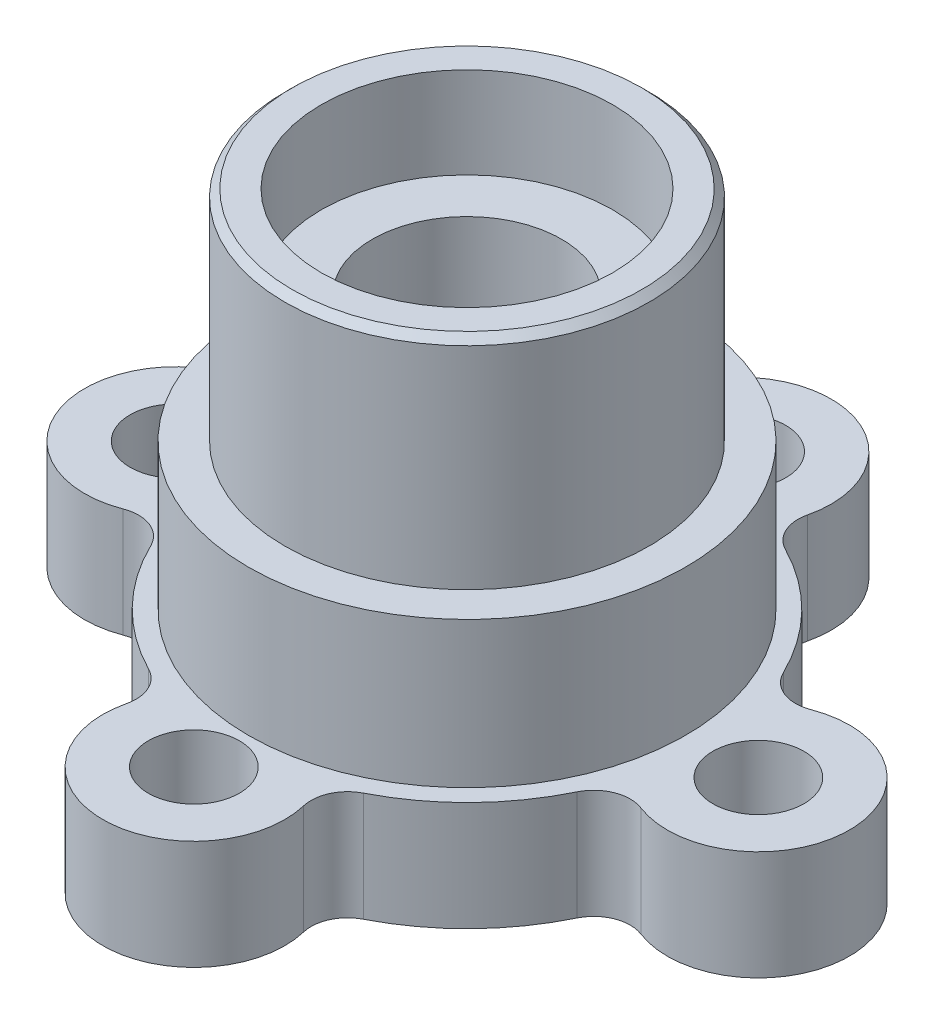
ISO-10303-21;
HEADER;
FILE_DESCRIPTION(('STEP AP214'),'2;1');
FILE_NAME('part.step','',(''),(''),'','','');
FILE_SCHEMA(('AUTOMOTIVE_DESIGN { 1 0 10303 214 1 1 1 1 }'));
ENDSEC;
DATA;
#1=APPLICATION_CONTEXT('core data for automotive mechanical design processes');
#2=APPLICATION_PROTOCOL_DEFINITION('international standard','automotive_design',2000,#1);
#3=PRODUCT_CONTEXT('',#1,'mechanical');
#4=PRODUCT('Part','Part','',(#3));
#5=PRODUCT_RELATED_PRODUCT_CATEGORY('part','',(#4));
#6=PRODUCT_DEFINITION_FORMATION('','',#4);
#7=PRODUCT_DEFINITION_CONTEXT('part definition',#1,'design');
#8=PRODUCT_DEFINITION('design','',#6,#7);
#9=PRODUCT_DEFINITION_SHAPE('','',#8);
#10=(LENGTH_UNIT() NAMED_UNIT(*) SI_UNIT(.MILLI.,.METRE.));
#11=(NAMED_UNIT(*) PLANE_ANGLE_UNIT() SI_UNIT($,.RADIAN.));
#12=(NAMED_UNIT(*) SI_UNIT($,.STERADIAN.) SOLID_ANGLE_UNIT());
#13=UNCERTAINTY_MEASURE_WITH_UNIT(LENGTH_MEASURE(1.E-05),#10,'distance_accuracy_value','');
#14=(GEOMETRIC_REPRESENTATION_CONTEXT(3) GLOBAL_UNCERTAINTY_ASSIGNED_CONTEXT((#13)) GLOBAL_UNIT_ASSIGNED_CONTEXT((#10,
#11,#12)) REPRESENTATION_CONTEXT('',''));
#15=CARTESIAN_POINT('',(0.,0.,0.));
#16=DIRECTION('',(0.,0.,1.));
#17=DIRECTION('',(1.,0.,0.));
#18=AXIS2_PLACEMENT_3D('',#15,#16,#17);
#19=CARTESIAN_POINT('',(0.,0.,0.));
#20=DIRECTION('',(0.,1.,0.));
#21=DIRECTION('',(0.,0.,1.));
#22=AXIS2_PLACEMENT_3D('',#19,#20,#21);
#23=CYLINDRICAL_SURFACE('',#22,2.6);
#24=CARTESIAN_POINT('',(0.,10.5,0.));
#25=DIRECTION('',(0.,1.,0.));
#26=DIRECTION('',(0.,0.,1.));
#27=AXIS2_PLACEMENT_3D('',#24,#25,#26);
#28=CIRCLE('',#27,2.6);
#29=CARTESIAN_POINT('',(0.,10.5,2.6));
#30=VERTEX_POINT('',#29);
#31=EDGE_CURVE('E208',#30,#30,#28,.F.);
#32=ORIENTED_EDGE('',*,*,#31,.F.);
#33=EDGE_LOOP('',(#32));
#34=FACE_BOUND('',#33,.T.);
#35=CARTESIAN_POINT('',(0.,3.,0.));
#36=DIRECTION('',(0.,-1.,0.));
#37=DIRECTION('',(0.,0.,-1.));
#38=AXIS2_PLACEMENT_3D('',#35,#36,#37);
#39=CIRCLE('',#38,2.6);
#40=CARTESIAN_POINT('',(0.,3.,-2.6));
#41=VERTEX_POINT('',#40);
#42=EDGE_CURVE('E214',#41,#41,#39,.F.);
#43=ORIENTED_EDGE('',*,*,#42,.F.);
#44=EDGE_LOOP('',(#43));
#45=FACE_BOUND('',#44,.T.);
#46=ADVANCED_FACE('F45',(#34,#45),#23,.F.);
#47=CARTESIAN_POINT('',(0.,3.,0.));
#48=DIRECTION('',(0.,-1.,0.));
#49=DIRECTION('',(0.,0.,-1.));
#50=AXIS2_PLACEMENT_3D('',#47,#48,#49);
#51=CYLINDRICAL_SURFACE('',#50,6.5);
#52=CARTESIAN_POINT('',(0.,0.,0.));
#53=DIRECTION('',(0.,1.,0.));
#54=DIRECTION('',(0.,0.,1.));
#55=AXIS2_PLACEMENT_3D('',#52,#53,#54);
#56=CIRCLE('',#55,6.5);
#57=CARTESIAN_POINT('',(5.85,0.,-2.83328431330144));
#58=VERTEX_POINT('',#57);
#59=CARTESIAN_POINT('',(2.94960365615366,0.,-5.79222222222222));
#60=VERTEX_POINT('',#59);
#61=EDGE_CURVE('E337',#58,#60,#56,.T.);
#62=ORIENTED_EDGE('',*,*,#61,.T.);
#63=DIRECTION('',(0.,-1.,0.));
#64=VECTOR('',#63,1.);
#65=CARTESIAN_POINT('',(2.94960365615366,3.,-5.79222222222222));
#66=LINE('',#65,#64);
#67=CARTESIAN_POINT('',(2.94960365615366,3.,-5.79222222222222));
#68=VERTEX_POINT('',#67);
#69=EDGE_CURVE('E261',#60,#68,#66,.F.);
#70=ORIENTED_EDGE('',*,*,#69,.T.);
#71=CARTESIAN_POINT('',(0.,3.,0.));
#72=DIRECTION('',(0.,1.,0.));
#73=DIRECTION('',(0.,0.,1.));
#74=AXIS2_PLACEMENT_3D('',#71,#72,#73);
#75=CIRCLE('',#74,6.5);
#76=CARTESIAN_POINT('',(5.85,3.,-2.83328431330144));
#77=VERTEX_POINT('',#76);
#78=EDGE_CURVE('E207',#77,#68,#75,.T.);
#79=ORIENTED_EDGE('',*,*,#78,.F.);
#80=DIRECTION('',(0.,-1.,0.));
#81=VECTOR('',#80,1.);
#82=CARTESIAN_POINT('',(5.85,3.,-2.83328431330144));
#83=LINE('',#82,#81);
#84=EDGE_CURVE('E257',#77,#58,#83,.T.);
#85=ORIENTED_EDGE('',*,*,#84,.T.);
#86=EDGE_LOOP('',(#62,#70,#79,#85));
#87=FACE_BOUND('',#86,.T.);
#88=ADVANCED_FACE('F462',(#87),#51,.T.);
#89=CARTESIAN_POINT('',(0.,3.,-7.5));
#90=DIRECTION('',(0.,-1.,0.));
#91=DIRECTION('',(0.,0.,-1.));
#92=AXIS2_PLACEMENT_3D('',#89,#90,#91);
#93=CYLINDRICAL_SURFACE('',#92,2.5);
#94=CARTESIAN_POINT('',(0.,0.,-7.5));
#95=DIRECTION('',(0.,1.,0.));
#96=DIRECTION('',(0.,0.,1.));
#97=AXIS2_PLACEMENT_3D('',#94,#95,#96);
#98=CIRCLE('',#97,2.5);
#99=CARTESIAN_POINT('',(2.43099202430247,0.,-6.91666666666667));
#100=VERTEX_POINT('',#99);
#101=CARTESIAN_POINT('',(-2.43099202430247,0.,-6.91666666666667));
#102=VERTEX_POINT('',#101);
#103=EDGE_CURVE('E341',#100,#102,#98,.T.);
#104=ORIENTED_EDGE('',*,*,#103,.T.);
#105=DIRECTION('',(0.,-1.,0.));
#106=VECTOR('',#105,1.);
#107=CARTESIAN_POINT('',(-2.43099202430247,3.,-6.91666666666667));
#108=LINE('',#107,#106);
#109=CARTESIAN_POINT('',(-2.43099202430247,3.,-6.91666666666667));
#110=VERTEX_POINT('',#109);
#111=EDGE_CURVE('E254',#102,#110,#108,.F.);
#112=ORIENTED_EDGE('',*,*,#111,.T.);
#113=CARTESIAN_POINT('',(0.,3.,-7.5));
#114=DIRECTION('',(0.,1.,0.));
#115=DIRECTION('',(0.,0.,1.));
#116=AXIS2_PLACEMENT_3D('',#113,#114,#115);
#117=CIRCLE('',#116,2.5);
#118=CARTESIAN_POINT('',(2.43099202430247,3.,-6.91666666666667));
#119=VERTEX_POINT('',#118);
#120=EDGE_CURVE('E368',#119,#110,#117,.T.);
#121=ORIENTED_EDGE('',*,*,#120,.F.);
#122=DIRECTION('',(0.,-1.,0.));
#123=VECTOR('',#122,1.);
#124=CARTESIAN_POINT('',(2.43099202430247,3.,-6.91666666666667));
#125=LINE('',#124,#123);
#126=EDGE_CURVE('E250',#119,#100,#125,.T.);
#127=ORIENTED_EDGE('',*,*,#126,.T.);
#128=EDGE_LOOP('',(#104,#112,#121,#127));
#129=FACE_BOUND('',#128,.T.);
#130=ADVANCED_FACE('F468',(#129),#93,.T.);
#131=CARTESIAN_POINT('',(0.,3.,0.));
#132=DIRECTION('',(0.,-1.,0.));
#133=DIRECTION('',(0.,0.,-1.));
#134=AXIS2_PLACEMENT_3D('',#131,#132,#133);
#135=CYLINDRICAL_SURFACE('',#134,6.5);
#136=CARTESIAN_POINT('',(0.,0.,0.));
#137=DIRECTION('',(0.,1.,0.));
#138=DIRECTION('',(0.,0.,1.));
#139=AXIS2_PLACEMENT_3D('',#136,#137,#138);
#140=CIRCLE('',#139,6.5);
#141=CARTESIAN_POINT('',(-2.94960365615366,0.,-5.79222222222222));
#142=VERTEX_POINT('',#141);
#143=CARTESIAN_POINT('',(-5.85,0.,-2.83328431330144));
#144=VERTEX_POINT('',#143);
#145=EDGE_CURVE('E197',#142,#144,#140,.T.);
#146=ORIENTED_EDGE('',*,*,#145,.T.);
#147=DIRECTION('',(0.,-1.,0.));
#148=VECTOR('',#147,1.);
#149=CARTESIAN_POINT('',(-5.85,3.,-2.83328431330144));
#150=LINE('',#149,#148);
#151=CARTESIAN_POINT('',(-5.85,3.,-2.83328431330144));
#152=VERTEX_POINT('',#151);
#153=EDGE_CURVE('E247',#144,#152,#150,.F.);
#154=ORIENTED_EDGE('',*,*,#153,.T.);
#155=CARTESIAN_POINT('',(0.,3.,0.));
#156=DIRECTION('',(0.,1.,0.));
#157=DIRECTION('',(0.,0.,1.));
#158=AXIS2_PLACEMENT_3D('',#155,#156,#157);
#159=CIRCLE('',#158,6.5);
#160=CARTESIAN_POINT('',(-2.94960365615366,3.,-5.79222222222222));
#161=VERTEX_POINT('',#160);
#162=EDGE_CURVE('E361',#161,#152,#159,.T.);
#163=ORIENTED_EDGE('',*,*,#162,.F.);
#164=DIRECTION('',(0.,-1.,0.));
#165=VECTOR('',#164,1.);
#166=CARTESIAN_POINT('',(-2.94960365615367,3.,-5.79222222222222));
#167=LINE('',#166,#165);
#168=EDGE_CURVE('E243',#161,#142,#167,.T.);
#169=ORIENTED_EDGE('',*,*,#168,.T.);
#170=EDGE_LOOP('',(#146,#154,#163,#169));
#171=FACE_BOUND('',#170,.T.);
#172=ADVANCED_FACE('F349',(#171),#135,.T.);
#173=CARTESIAN_POINT('',(-8.,3.,0.));
#174=DIRECTION('',(0.,-1.,0.));
#175=DIRECTION('',(0.,0.,-1.));
#176=AXIS2_PLACEMENT_3D('',#173,#174,#175);
#177=CYLINDRICAL_SURFACE('',#176,2.5);
#178=CARTESIAN_POINT('',(-8.,0.,0.));
#179=DIRECTION('',(0.,1.,0.));
#180=DIRECTION('',(0.,0.,1.));
#181=AXIS2_PLACEMENT_3D('',#178,#179,#180);
#182=CIRCLE('',#181,2.5);
#183=CARTESIAN_POINT('',(-7.10714285714286,0.,-2.33512443403965));
#184=VERTEX_POINT('',#183);
#185=CARTESIAN_POINT('',(-7.10714285714286,0.,2.33512443403965));
#186=VERTEX_POINT('',#185);
#187=EDGE_CURVE('E190',#184,#186,#182,.T.);
#188=ORIENTED_EDGE('',*,*,#187,.T.);
#189=DIRECTION('',(0.,-1.,0.));
#190=VECTOR('',#189,1.);
#191=CARTESIAN_POINT('',(-7.10714285714286,3.,2.33512443403965));
#192=LINE('',#191,#190);
#193=CARTESIAN_POINT('',(-7.10714285714286,3.,2.33512443403965));
#194=VERTEX_POINT('',#193);
#195=EDGE_CURVE('E164',#186,#194,#192,.F.);
#196=ORIENTED_EDGE('',*,*,#195,.T.);
#197=CARTESIAN_POINT('',(-8.,3.,0.));
#198=DIRECTION('',(0.,1.,0.));
#199=DIRECTION('',(0.,0.,1.));
#200=AXIS2_PLACEMENT_3D('',#197,#198,#199);
#201=CIRCLE('',#200,2.5);
#202=CARTESIAN_POINT('',(-7.10714285714286,3.,-2.33512443403965));
#203=VERTEX_POINT('',#202);
#204=EDGE_CURVE('E360',#203,#194,#201,.T.);
#205=ORIENTED_EDGE('',*,*,#204,.F.);
#206=DIRECTION('',(0.,-1.,0.));
#207=VECTOR('',#206,1.);
#208=CARTESIAN_POINT('',(-7.10714285714286,3.,-2.33512443403965));
#209=LINE('',#208,#207);
#210=EDGE_CURVE('E181',#203,#184,#209,.T.);
#211=ORIENTED_EDGE('',*,*,#210,.T.);
#212=EDGE_LOOP('',(#188,#196,#205,#211));
#213=FACE_BOUND('',#212,.T.);
#214=ADVANCED_FACE('F363',(#213),#177,.T.);
#215=CARTESIAN_POINT('',(0.,3.,0.));
#216=DIRECTION('',(0.,-1.,0.));
#217=DIRECTION('',(0.,0.,-1.));
#218=AXIS2_PLACEMENT_3D('',#215,#216,#217);
#219=CYLINDRICAL_SURFACE('',#218,6.5);
#220=CARTESIAN_POINT('',(0.,3.,0.));
#221=DIRECTION('',(0.,1.,0.));
#222=DIRECTION('',(0.,0.,1.));
#223=AXIS2_PLACEMENT_3D('',#220,#221,#222);
#224=CIRCLE('',#223,6.5);
#225=CARTESIAN_POINT('',(-5.85,3.,2.83328431330144));
#226=VERTEX_POINT('',#225);
#227=CARTESIAN_POINT('',(-2.94960365615366,3.,5.79222222222222));
#228=VERTEX_POINT('',#227);
#229=EDGE_CURVE('E179',#226,#228,#224,.T.);
#230=ORIENTED_EDGE('',*,*,#229,.F.);
#231=DIRECTION('',(0.,-1.,0.));
#232=VECTOR('',#231,1.);
#233=CARTESIAN_POINT('',(-5.85,3.,2.83328431330144));
#234=LINE('',#233,#232);
#235=CARTESIAN_POINT('',(-5.85,0.,2.83328431330144));
#236=VERTEX_POINT('',#235);
#237=EDGE_CURVE('E163',#226,#236,#234,.T.);
#238=ORIENTED_EDGE('',*,*,#237,.T.);
#239=CARTESIAN_POINT('',(0.,0.,0.));
#240=DIRECTION('',(0.,1.,0.));
#241=DIRECTION('',(0.,0.,1.));
#242=AXIS2_PLACEMENT_3D('',#239,#240,#241);
#243=CIRCLE('',#242,6.5);
#244=CARTESIAN_POINT('',(-2.94960365615366,0.,5.79222222222222));
#245=VERTEX_POINT('',#244);
#246=EDGE_CURVE('E176',#236,#245,#243,.T.);
#247=ORIENTED_EDGE('',*,*,#246,.T.);
#248=DIRECTION('',(0.,-1.,0.));
#249=VECTOR('',#248,1.);
#250=CARTESIAN_POINT('',(-2.94960365615366,3.,5.79222222222222));
#251=LINE('',#250,#249);
#252=EDGE_CURVE('E182',#245,#228,#251,.F.);
#253=ORIENTED_EDGE('',*,*,#252,.T.);
#254=EDGE_LOOP('',(#230,#238,#247,#253));
#255=FACE_BOUND('',#254,.T.);
#256=ADVANCED_FACE('F175',(#255),#219,.T.);
#257=CARTESIAN_POINT('',(0.,3.,7.5));
#258=DIRECTION('',(0.,-1.,0.));
#259=DIRECTION('',(0.,0.,-1.));
#260=AXIS2_PLACEMENT_3D('',#257,#258,#259);
#261=CYLINDRICAL_SURFACE('',#260,2.5);
#262=CARTESIAN_POINT('',(0.,3.,7.5));
#263=DIRECTION('',(0.,1.,0.));
#264=DIRECTION('',(0.,0.,1.));
#265=AXIS2_PLACEMENT_3D('',#262,#263,#264);
#266=CIRCLE('',#265,2.5);
#267=CARTESIAN_POINT('',(-2.43099202430247,3.,6.91666666666667));
#268=VERTEX_POINT('',#267);
#269=CARTESIAN_POINT('',(2.43099202430247,3.,6.91666666666667));
#270=VERTEX_POINT('',#269);
#271=EDGE_CURVE('E327',#268,#270,#266,.T.);
#272=ORIENTED_EDGE('',*,*,#271,.F.);
#273=DIRECTION('',(0.,-1.,0.));
#274=VECTOR('',#273,1.);
#275=CARTESIAN_POINT('',(-2.43099202430247,3.,6.91666666666667));
#276=LINE('',#275,#274);
#277=CARTESIAN_POINT('',(-2.43099202430247,0.,6.91666666666667));
#278=VERTEX_POINT('',#277);
#279=EDGE_CURVE('E239',#268,#278,#276,.T.);
#280=ORIENTED_EDGE('',*,*,#279,.T.);
#281=CARTESIAN_POINT('',(0.,0.,7.5));
#282=DIRECTION('',(0.,1.,0.));
#283=DIRECTION('',(0.,0.,1.));
#284=AXIS2_PLACEMENT_3D('',#281,#282,#283);
#285=CIRCLE('',#284,2.5);
#286=CARTESIAN_POINT('',(2.43099202430247,0.,6.91666666666667));
#287=VERTEX_POINT('',#286);
#288=EDGE_CURVE('E189',#278,#287,#285,.T.);
#289=ORIENTED_EDGE('',*,*,#288,.T.);
#290=DIRECTION('',(0.,-1.,0.));
#291=VECTOR('',#290,1.);
#292=CARTESIAN_POINT('',(2.43099202430247,3.,6.91666666666667));
#293=LINE('',#292,#291);
#294=EDGE_CURVE('E236',#287,#270,#293,.F.);
#295=ORIENTED_EDGE('',*,*,#294,.T.);
#296=EDGE_LOOP('',(#272,#280,#289,#295));
#297=FACE_BOUND('',#296,.T.);
#298=ADVANCED_FACE('F320',(#297),#261,.T.);
#299=CARTESIAN_POINT('',(0.,3.,0.));
#300=DIRECTION('',(0.,-1.,0.));
#301=DIRECTION('',(0.,0.,-1.));
#302=AXIS2_PLACEMENT_3D('',#299,#300,#301);
#303=CYLINDRICAL_SURFACE('',#302,6.5);
#304=CARTESIAN_POINT('',(0.,0.,0.));
#305=DIRECTION('',(0.,1.,0.));
#306=DIRECTION('',(0.,0.,1.));
#307=AXIS2_PLACEMENT_3D('',#304,#305,#306);
#308=CIRCLE('',#307,6.5);
#309=CARTESIAN_POINT('',(2.94960365615366,0.,5.79222222222222));
#310=VERTEX_POINT('',#309);
#311=CARTESIAN_POINT('',(5.85,0.,2.83328431330144));
#312=VERTEX_POINT('',#311);
#313=EDGE_CURVE('E195',#310,#312,#308,.T.);
#314=ORIENTED_EDGE('',*,*,#313,.T.);
#315=DIRECTION('',(0.,-1.,0.));
#316=VECTOR('',#315,1.);
#317=CARTESIAN_POINT('',(5.85,3.,2.83328431330144));
#318=LINE('',#317,#316);
#319=CARTESIAN_POINT('',(5.85,3.,2.83328431330144));
#320=VERTEX_POINT('',#319);
#321=EDGE_CURVE('E61',#312,#320,#318,.F.);
#322=ORIENTED_EDGE('',*,*,#321,.T.);
#323=CARTESIAN_POINT('',(0.,3.,0.));
#324=DIRECTION('',(0.,1.,0.));
#325=DIRECTION('',(0.,0.,1.));
#326=AXIS2_PLACEMENT_3D('',#323,#324,#325);
#327=CIRCLE('',#326,6.5);
#328=CARTESIAN_POINT('',(2.94960365615366,3.,5.79222222222222));
#329=VERTEX_POINT('',#328);
#330=EDGE_CURVE('E323',#329,#320,#327,.T.);
#331=ORIENTED_EDGE('',*,*,#330,.F.);
#332=DIRECTION('',(0.,-1.,0.));
#333=VECTOR('',#332,1.);
#334=CARTESIAN_POINT('',(2.94960365615366,3.,5.79222222222222));
#335=LINE('',#334,#333);
#336=EDGE_CURVE('E271',#329,#310,#335,.T.);
#337=ORIENTED_EDGE('',*,*,#336,.T.);
#338=EDGE_LOOP('',(#314,#322,#331,#337));
#339=FACE_BOUND('',#338,.T.);
#340=ADVANCED_FACE('F322',(#339),#303,.T.);
#341=CARTESIAN_POINT('',(8.,3.,0.));
#342=DIRECTION('',(0.,-1.,0.));
#343=DIRECTION('',(0.,0.,-1.));
#344=AXIS2_PLACEMENT_3D('',#341,#342,#343);
#345=CYLINDRICAL_SURFACE('',#344,2.5);
#346=CARTESIAN_POINT('',(8.,0.,0.));
#347=DIRECTION('',(0.,1.,0.));
#348=DIRECTION('',(0.,0.,1.));
#349=AXIS2_PLACEMENT_3D('',#346,#347,#348);
#350=CIRCLE('',#349,2.5);
#351=CARTESIAN_POINT('',(7.10714285714286,0.,2.33512443403965));
#352=VERTEX_POINT('',#351);
#353=CARTESIAN_POINT('',(7.10714285714286,0.,-2.33512443403965));
#354=VERTEX_POINT('',#353);
#355=EDGE_CURVE('E203',#352,#354,#350,.T.);
#356=ORIENTED_EDGE('',*,*,#355,.T.);
#357=DIRECTION('',(0.,-1.,0.));
#358=VECTOR('',#357,1.);
#359=CARTESIAN_POINT('',(7.10714285714286,3.,-2.33512443403965));
#360=LINE('',#359,#358);
#361=CARTESIAN_POINT('',(7.10714285714286,3.,-2.33512443403965));
#362=VERTEX_POINT('',#361);
#363=EDGE_CURVE('E268',#354,#362,#360,.F.);
#364=ORIENTED_EDGE('',*,*,#363,.T.);
#365=CARTESIAN_POINT('',(8.,3.,0.));
#366=DIRECTION('',(0.,1.,0.));
#367=DIRECTION('',(0.,0.,1.));
#368=AXIS2_PLACEMENT_3D('',#365,#366,#367);
#369=CIRCLE('',#368,2.5);
#370=CARTESIAN_POINT('',(7.10714285714286,3.,2.33512443403965));
#371=VERTEX_POINT('',#370);
#372=EDGE_CURVE('E326',#371,#362,#369,.T.);
#373=ORIENTED_EDGE('',*,*,#372,.F.);
#374=DIRECTION('',(0.,-1.,0.));
#375=VECTOR('',#374,1.);
#376=CARTESIAN_POINT('',(7.10714285714286,3.,2.33512443403965));
#377=LINE('',#376,#375);
#378=EDGE_CURVE('E264',#371,#352,#377,.T.);
#379=ORIENTED_EDGE('',*,*,#378,.T.);
#380=EDGE_LOOP('',(#356,#364,#373,#379));
#381=FACE_BOUND('',#380,.T.);
#382=ADVANCED_FACE('F436',(#381),#345,.T.);
#383=CARTESIAN_POINT('',(0.,3.,-3.75));
#384=DIRECTION('',(0.,1.,0.));
#385=DIRECTION('',(0.,0.,1.));
#386=AXIS2_PLACEMENT_3D('',#383,#384,#385);
#387=PLANE('',#386);
#388=CARTESIAN_POINT('',(0.,3.,-7.5));
#389=DIRECTION('',(0.,1.,0.));
#390=DIRECTION('',(0.,0.,1.));
#391=AXIS2_PLACEMENT_3D('',#388,#389,#390);
#392=CIRCLE('',#391,1.25);
#393=CARTESIAN_POINT('',(0.,3.,-6.25));
#394=VERTEX_POINT('',#393);
#395=EDGE_CURVE('E427',#394,#394,#392,.T.);
#396=ORIENTED_EDGE('',*,*,#395,.F.);
#397=EDGE_LOOP('',(#396));
#398=FACE_BOUND('',#397,.T.);
#399=CARTESIAN_POINT('',(8.,3.,0.));
#400=DIRECTION('',(0.,1.,0.));
#401=DIRECTION('',(0.,0.,1.));
#402=AXIS2_PLACEMENT_3D('',#399,#400,#401);
#403=CIRCLE('',#402,1.25);
#404=CARTESIAN_POINT('',(8.,3.,1.25));
#405=VERTEX_POINT('',#404);
#406=EDGE_CURVE('E419',#405,#405,#403,.T.);
#407=ORIENTED_EDGE('',*,*,#406,.F.);
#408=EDGE_LOOP('',(#407));
#409=FACE_BOUND('',#408,.T.);
#410=CARTESIAN_POINT('',(0.,3.,7.5));
#411=DIRECTION('',(0.,1.,0.));
#412=DIRECTION('',(0.,0.,1.));
#413=AXIS2_PLACEMENT_3D('',#410,#411,#412);
#414=CIRCLE('',#413,1.25);
#415=CARTESIAN_POINT('',(0.,3.,8.75));
#416=VERTEX_POINT('',#415);
#417=EDGE_CURVE('E411',#416,#416,#414,.T.);
#418=ORIENTED_EDGE('',*,*,#417,.F.);
#419=EDGE_LOOP('',(#418));
#420=FACE_BOUND('',#419,.T.);
#421=CARTESIAN_POINT('',(-8.,3.,0.));
#422=DIRECTION('',(0.,1.,0.));
#423=DIRECTION('',(0.,0.,1.));
#424=AXIS2_PLACEMENT_3D('',#421,#422,#423);
#425=CIRCLE('',#424,1.25);
#426=CARTESIAN_POINT('',(-8.,3.,1.25));
#427=VERTEX_POINT('',#426);
#428=EDGE_CURVE('E403',#427,#427,#425,.T.);
#429=ORIENTED_EDGE('',*,*,#428,.F.);
#430=EDGE_LOOP('',(#429));
#431=FACE_BOUND('',#430,.T.);
#432=CARTESIAN_POINT('',(0.,3.,0.));
#433=DIRECTION('',(0.,1.,0.));
#434=DIRECTION('',(0.,0.,1.));
#435=AXIS2_PLACEMENT_3D('',#432,#433,#434);
#436=CIRCLE('',#435,6.);
#437=CARTESIAN_POINT('',(0.,3.,6.));
#438=VERTEX_POINT('',#437);
#439=EDGE_CURVE('E332',#438,#438,#436,.T.);
#440=ORIENTED_EDGE('',*,*,#439,.F.);
#441=EDGE_LOOP('',(#440));
#442=FACE_BOUND('',#441,.T.);
#443=ORIENTED_EDGE('',*,*,#372,.T.);
#444=CARTESIAN_POINT('',(6.75,3.,-3.26917420765551));
#445=DIRECTION('',(0.,1.,0.));
#446=DIRECTION('',(0.,0.,1.));
#447=AXIS2_PLACEMENT_3D('',#444,#445,#446);
#448=CIRCLE('',#447,1.);
#449=EDGE_CURVE('E305',#362,#77,#448,.F.);
#450=ORIENTED_EDGE('',*,*,#449,.T.);
#451=ORIENTED_EDGE('',*,*,#78,.T.);
#452=CARTESIAN_POINT('',(3.40338883402346,3.,-6.68333333333333));
#453=DIRECTION('',(0.,1.,0.));
#454=DIRECTION('',(0.,0.,1.));
#455=AXIS2_PLACEMENT_3D('',#452,#453,#454);
#456=CIRCLE('',#455,1.);
#457=EDGE_CURVE('E299',#68,#119,#456,.F.);
#458=ORIENTED_EDGE('',*,*,#457,.T.);
#459=ORIENTED_EDGE('',*,*,#120,.T.);
#460=CARTESIAN_POINT('',(-3.40338883402346,3.,-6.68333333333333));
#461=DIRECTION('',(0.,1.,0.));
#462=DIRECTION('',(0.,0.,1.));
#463=AXIS2_PLACEMENT_3D('',#460,#461,#462);
#464=CIRCLE('',#463,1.);
#465=EDGE_CURVE('E293',#110,#161,#464,.F.);
#466=ORIENTED_EDGE('',*,*,#465,.T.);
#467=ORIENTED_EDGE('',*,*,#162,.T.);
#468=CARTESIAN_POINT('',(-6.75,3.,-3.26917420765551));
#469=DIRECTION('',(0.,1.,0.));
#470=DIRECTION('',(0.,0.,1.));
#471=AXIS2_PLACEMENT_3D('',#468,#469,#470);
#472=CIRCLE('',#471,1.);
#473=EDGE_CURVE('E287',#152,#203,#472,.F.);
#474=ORIENTED_EDGE('',*,*,#473,.T.);
#475=ORIENTED_EDGE('',*,*,#204,.T.);
#476=CARTESIAN_POINT('',(-6.75,3.,3.26917420765551));
#477=DIRECTION('',(0.,1.,0.));
#478=DIRECTION('',(0.,0.,1.));
#479=AXIS2_PLACEMENT_3D('',#476,#477,#478);
#480=CIRCLE('',#479,1.);
#481=EDGE_CURVE('E170',#194,#226,#480,.F.);
#482=ORIENTED_EDGE('',*,*,#481,.T.);
#483=ORIENTED_EDGE('',*,*,#229,.T.);
#484=CARTESIAN_POINT('',(-3.40338883402346,3.,6.68333333333333));
#485=DIRECTION('',(0.,1.,0.));
#486=DIRECTION('',(0.,0.,1.));
#487=AXIS2_PLACEMENT_3D('',#484,#485,#486);
#488=CIRCLE('',#487,1.);
#489=EDGE_CURVE('E281',#228,#268,#488,.F.);
#490=ORIENTED_EDGE('',*,*,#489,.T.);
#491=ORIENTED_EDGE('',*,*,#271,.T.);
#492=CARTESIAN_POINT('',(3.40338883402346,3.,6.68333333333333));
#493=DIRECTION('',(0.,1.,0.));
#494=DIRECTION('',(0.,0.,1.));
#495=AXIS2_PLACEMENT_3D('',#492,#493,#494);
#496=CIRCLE('',#495,1.);
#497=EDGE_CURVE('E11',#270,#329,#496,.F.);
#498=ORIENTED_EDGE('',*,*,#497,.T.);
#499=ORIENTED_EDGE('',*,*,#330,.T.);
#500=CARTESIAN_POINT('',(6.75,3.,3.26917420765551));
#501=DIRECTION('',(0.,1.,0.));
#502=DIRECTION('',(0.,0.,1.));
#503=AXIS2_PLACEMENT_3D('',#500,#501,#502);
#504=CIRCLE('',#503,1.);
#505=EDGE_CURVE('E311',#320,#371,#504,.F.);
#506=ORIENTED_EDGE('',*,*,#505,.T.);
#507=EDGE_LOOP('',(#443,#450,#451,#458,#459,#466,#467,#474,#475,#482,#483,#490,#491,#498,#499,#506));
#508=FACE_BOUND('',#507,.T.);
#509=ADVANCED_FACE('F359',(#398,#409,#420,#431,#442,#508),#387,.T.);
#510=CARTESIAN_POINT('',(0.,0.,-3.75));
#511=DIRECTION('',(0.,1.,0.));
#512=DIRECTION('',(0.,0.,1.));
#513=AXIS2_PLACEMENT_3D('',#510,#511,#512);
#514=PLANE('',#513);
#515=CARTESIAN_POINT('',(0.,0.,-7.5));
#516=DIRECTION('',(0.,1.,0.));
#517=DIRECTION('',(0.,0.,1.));
#518=AXIS2_PLACEMENT_3D('',#515,#516,#517);
#519=CIRCLE('',#518,1.25);
#520=CARTESIAN_POINT('',(0.,0.,-6.25));
#521=VERTEX_POINT('',#520);
#522=EDGE_CURVE('E423',#521,#521,#519,.T.);
#523=ORIENTED_EDGE('',*,*,#522,.T.);
#524=EDGE_LOOP('',(#523));
#525=FACE_BOUND('',#524,.T.);
#526=CARTESIAN_POINT('',(8.,0.,0.));
#527=DIRECTION('',(0.,1.,0.));
#528=DIRECTION('',(0.,0.,1.));
#529=AXIS2_PLACEMENT_3D('',#526,#527,#528);
#530=CIRCLE('',#529,1.25);
#531=CARTESIAN_POINT('',(8.,0.,1.25));
#532=VERTEX_POINT('',#531);
#533=EDGE_CURVE('E415',#532,#532,#530,.T.);
#534=ORIENTED_EDGE('',*,*,#533,.T.);
#535=EDGE_LOOP('',(#534));
#536=FACE_BOUND('',#535,.T.);
#537=CARTESIAN_POINT('',(0.,0.,7.5));
#538=DIRECTION('',(0.,1.,0.));
#539=DIRECTION('',(0.,0.,1.));
#540=AXIS2_PLACEMENT_3D('',#537,#538,#539);
#541=CIRCLE('',#540,1.25);
#542=CARTESIAN_POINT('',(0.,0.,8.75));
#543=VERTEX_POINT('',#542);
#544=EDGE_CURVE('E407',#543,#543,#541,.T.);
#545=ORIENTED_EDGE('',*,*,#544,.T.);
#546=EDGE_LOOP('',(#545));
#547=FACE_BOUND('',#546,.T.);
#548=CARTESIAN_POINT('',(-8.,0.,0.));
#549=DIRECTION('',(0.,1.,0.));
#550=DIRECTION('',(0.,0.,1.));
#551=AXIS2_PLACEMENT_3D('',#548,#549,#550);
#552=CIRCLE('',#551,1.25);
#553=CARTESIAN_POINT('',(-8.,0.,1.25));
#554=VERTEX_POINT('',#553);
#555=EDGE_CURVE('E396',#554,#554,#552,.T.);
#556=ORIENTED_EDGE('',*,*,#555,.T.);
#557=EDGE_LOOP('',(#556));
#558=FACE_BOUND('',#557,.T.);
#559=CARTESIAN_POINT('',(0.,0.,0.));
#560=DIRECTION('',(0.,-1.,0.));
#561=DIRECTION('',(0.,0.,-1.));
#562=AXIS2_PLACEMENT_3D('',#559,#560,#561);
#563=CIRCLE('',#562,4.);
#564=CARTESIAN_POINT('',(0.,0.,-4.));
#565=VERTEX_POINT('',#564);
#566=EDGE_CURVE('E392',#565,#565,#563,.T.);
#567=ORIENTED_EDGE('',*,*,#566,.F.);
#568=EDGE_LOOP('',(#567));
#569=FACE_BOUND('',#568,.T.);
#570=ORIENTED_EDGE('',*,*,#61,.F.);
#571=CARTESIAN_POINT('',(6.75,0.,-3.26917420765551));
#572=DIRECTION('',(0.,1.,0.));
#573=DIRECTION('',(0.,0.,1.));
#574=AXIS2_PLACEMENT_3D('',#571,#572,#573);
#575=CIRCLE('',#574,1.);
#576=EDGE_CURVE('E302',#58,#354,#575,.T.);
#577=ORIENTED_EDGE('',*,*,#576,.T.);
#578=ORIENTED_EDGE('',*,*,#355,.F.);
#579=CARTESIAN_POINT('',(6.75,0.,3.26917420765551));
#580=DIRECTION('',(0.,1.,0.));
#581=DIRECTION('',(0.,0.,1.));
#582=AXIS2_PLACEMENT_3D('',#579,#580,#581);
#583=CIRCLE('',#582,1.);
#584=EDGE_CURVE('E308',#352,#312,#583,.T.);
#585=ORIENTED_EDGE('',*,*,#584,.T.);
#586=ORIENTED_EDGE('',*,*,#313,.F.);
#587=CARTESIAN_POINT('',(3.40338883402346,0.,6.68333333333333));
#588=DIRECTION('',(0.,1.,0.));
#589=DIRECTION('',(0.,0.,1.));
#590=AXIS2_PLACEMENT_3D('',#587,#588,#589);
#591=CIRCLE('',#590,1.);
#592=EDGE_CURVE('E54',#310,#287,#591,.T.);
#593=ORIENTED_EDGE('',*,*,#592,.T.);
#594=ORIENTED_EDGE('',*,*,#288,.F.);
#595=CARTESIAN_POINT('',(-3.40338883402346,0.,6.68333333333333));
#596=DIRECTION('',(0.,1.,0.));
#597=DIRECTION('',(0.,0.,1.));
#598=AXIS2_PLACEMENT_3D('',#595,#596,#597);
#599=CIRCLE('',#598,1.);
#600=EDGE_CURVE('E187',#278,#245,#599,.T.);
#601=ORIENTED_EDGE('',*,*,#600,.T.);
#602=ORIENTED_EDGE('',*,*,#246,.F.);
#603=CARTESIAN_POINT('',(-6.75,0.,3.26917420765551));
#604=DIRECTION('',(0.,1.,0.));
#605=DIRECTION('',(0.,0.,1.));
#606=AXIS2_PLACEMENT_3D('',#603,#604,#605);
#607=CIRCLE('',#606,1.);
#608=EDGE_CURVE('E159',#236,#186,#607,.T.);
#609=ORIENTED_EDGE('',*,*,#608,.T.);
#610=ORIENTED_EDGE('',*,*,#187,.F.);
#611=CARTESIAN_POINT('',(-6.75,0.,-3.26917420765551));
#612=DIRECTION('',(0.,1.,0.));
#613=DIRECTION('',(0.,0.,1.));
#614=AXIS2_PLACEMENT_3D('',#611,#612,#613);
#615=CIRCLE('',#614,1.);
#616=EDGE_CURVE('E284',#184,#144,#615,.T.);
#617=ORIENTED_EDGE('',*,*,#616,.T.);
#618=ORIENTED_EDGE('',*,*,#145,.F.);
#619=CARTESIAN_POINT('',(-3.40338883402346,0.,-6.68333333333333));
#620=DIRECTION('',(0.,1.,0.));
#621=DIRECTION('',(0.,0.,1.));
#622=AXIS2_PLACEMENT_3D('',#619,#620,#621);
#623=CIRCLE('',#622,1.);
#624=EDGE_CURVE('E290',#142,#102,#623,.T.);
#625=ORIENTED_EDGE('',*,*,#624,.T.);
#626=ORIENTED_EDGE('',*,*,#103,.F.);
#627=CARTESIAN_POINT('',(3.40338883402346,0.,-6.68333333333333));
#628=DIRECTION('',(0.,1.,0.));
#629=DIRECTION('',(0.,0.,1.));
#630=AXIS2_PLACEMENT_3D('',#627,#628,#629);
#631=CIRCLE('',#630,1.);
#632=EDGE_CURVE('E296',#100,#60,#631,.T.);
#633=ORIENTED_EDGE('',*,*,#632,.T.);
#634=EDGE_LOOP('',(#570,#577,#578,#585,#586,#593,#594,#601,#602,#609,#610,#617,#618,#625,#626,#633));
#635=FACE_BOUND('',#634,.T.);
#636=ADVANCED_FACE('F185',(#525,#536,#547,#558,#569,#635),#514,.F.);
#637=CARTESIAN_POINT('',(0.,7.,0.));
#638=DIRECTION('',(0.,-1.,0.));
#639=DIRECTION('',(0.,0.,-1.));
#640=AXIS2_PLACEMENT_3D('',#637,#638,#639);
#641=CYLINDRICAL_SURFACE('',#640,6.);
#642=CARTESIAN_POINT('',(0.,7.,0.));
#643=DIRECTION('',(0.,1.,0.));
#644=DIRECTION('',(0.,0.,1.));
#645=AXIS2_PLACEMENT_3D('',#642,#643,#644);
#646=CIRCLE('',#645,6.);
#647=CARTESIAN_POINT('',(0.,7.,6.));
#648=VERTEX_POINT('',#647);
#649=EDGE_CURVE('E212',#648,#648,#646,.T.);
#650=ORIENTED_EDGE('',*,*,#649,.F.);
#651=EDGE_LOOP('',(#650));
#652=FACE_BOUND('',#651,.T.);
#653=ORIENTED_EDGE('',*,*,#439,.T.);
#654=EDGE_LOOP('',(#653));
#655=FACE_BOUND('',#654,.T.);
#656=ADVANCED_FACE('F446',(#652,#655),#641,.T.);
#657=CARTESIAN_POINT('',(0.,7.,0.));
#658=DIRECTION('',(0.,1.,0.));
#659=DIRECTION('',(0.,0.,1.));
#660=AXIS2_PLACEMENT_3D('',#657,#658,#659);
#661=PLANE('',#660);
#662=CARTESIAN_POINT('',(0.,7.,0.));
#663=DIRECTION('',(0.,1.,0.));
#664=DIRECTION('',(0.,0.,1.));
#665=AXIS2_PLACEMENT_3D('',#662,#663,#664);
#666=CIRCLE('',#665,5.);
#667=CARTESIAN_POINT('',(0.,7.,5.));
#668=VERTEX_POINT('',#667);
#669=EDGE_CURVE('E225',#668,#668,#666,.T.);
#670=ORIENTED_EDGE('',*,*,#669,.F.);
#671=EDGE_LOOP('',(#670));
#672=FACE_BOUND('',#671,.T.);
#673=ORIENTED_EDGE('',*,*,#649,.T.);
#674=EDGE_LOOP('',(#673));
#675=FACE_BOUND('',#674,.T.);
#676=ADVANCED_FACE('F448',(#672,#675),#661,.T.);
#677=CARTESIAN_POINT('',(0.,13.,0.));
#678=DIRECTION('',(0.,-1.,0.));
#679=DIRECTION('',(0.,0.,-1.));
#680=AXIS2_PLACEMENT_3D('',#677,#678,#679);
#681=CYLINDRICAL_SURFACE('',#680,5.);
#682=CARTESIAN_POINT('',(0.,12.8,0.));
#683=DIRECTION('',(0.,1.,0.));
#684=DIRECTION('',(0.,0.,1.));
#685=AXIS2_PLACEMENT_3D('',#682,#683,#684);
#686=CIRCLE('',#685,5.);
#687=CARTESIAN_POINT('',(0.,12.8,5.));
#688=VERTEX_POINT('',#687);
#689=EDGE_CURVE('E224',#688,#688,#686,.F.);
#690=ORIENTED_EDGE('',*,*,#689,.T.);
#691=EDGE_LOOP('',(#690));
#692=FACE_BOUND('',#691,.T.);
#693=ORIENTED_EDGE('',*,*,#669,.T.);
#694=EDGE_LOOP('',(#693));
#695=FACE_BOUND('',#694,.T.);
#696=ADVANCED_FACE('F455',(#692,#695),#681,.T.);
#697=CARTESIAN_POINT('',(0.,13.,0.));
#698=DIRECTION('',(0.,1.,0.));
#699=DIRECTION('',(0.,0.,1.));
#700=AXIS2_PLACEMENT_3D('',#697,#698,#699);
#701=PLANE('',#700);
#702=CARTESIAN_POINT('',(0.,13.,0.));
#703=DIRECTION('',(0.,1.,0.));
#704=DIRECTION('',(0.,0.,1.));
#705=AXIS2_PLACEMENT_3D('',#702,#703,#704);
#706=CIRCLE('',#705,4.8);
#707=CARTESIAN_POINT('',(0.,13.,4.8));
#708=VERTEX_POINT('',#707);
#709=EDGE_CURVE('E220',#708,#708,#706,.T.);
#710=ORIENTED_EDGE('',*,*,#709,.T.);
#711=EDGE_LOOP('',(#710));
#712=FACE_BOUND('',#711,.T.);
#713=CARTESIAN_POINT('',(0.,13.,0.));
#714=DIRECTION('',(0.,1.,0.));
#715=DIRECTION('',(0.,0.,1.));
#716=AXIS2_PLACEMENT_3D('',#713,#714,#715);
#717=CIRCLE('',#716,4.);
#718=CARTESIAN_POINT('',(0.,13.,4.));
#719=VERTEX_POINT('',#718);
#720=EDGE_CURVE('E218',#719,#719,#717,.T.);
#721=ORIENTED_EDGE('',*,*,#720,.F.);
#722=EDGE_LOOP('',(#721));
#723=FACE_BOUND('',#722,.T.);
#724=ADVANCED_FACE('F477',(#712,#723),#701,.T.);
#725=CARTESIAN_POINT('',(0.,10.5,0.));
#726=DIRECTION('',(0.,1.,0.));
#727=DIRECTION('',(0.,0.,1.));
#728=AXIS2_PLACEMENT_3D('',#725,#726,#727);
#729=PLANE('',#728);
#730=CARTESIAN_POINT('',(0.,10.5,0.));
#731=DIRECTION('',(0.,1.,0.));
#732=DIRECTION('',(0.,0.,1.));
#733=AXIS2_PLACEMENT_3D('',#730,#731,#732);
#734=CIRCLE('',#733,4.);
#735=CARTESIAN_POINT('',(0.,10.5,4.));
#736=VERTEX_POINT('',#735);
#737=EDGE_CURVE('E213',#736,#736,#734,.T.);
#738=ORIENTED_EDGE('',*,*,#737,.T.);
#739=EDGE_LOOP('',(#738));
#740=FACE_BOUND('',#739,.T.);
#741=ORIENTED_EDGE('',*,*,#31,.T.);
#742=EDGE_LOOP('',(#741));
#743=FACE_BOUND('',#742,.T.);
#744=ADVANCED_FACE('F480',(#740,#743),#729,.T.);
#745=CARTESIAN_POINT('',(0.,10.5,0.));
#746=DIRECTION('',(0.,1.,0.));
#747=DIRECTION('',(0.,0.,1.));
#748=AXIS2_PLACEMENT_3D('',#745,#746,#747);
#749=CYLINDRICAL_SURFACE('',#748,4.);
#750=ORIENTED_EDGE('',*,*,#737,.F.);
#751=EDGE_LOOP('',(#750));
#752=FACE_BOUND('',#751,.T.);
#753=ORIENTED_EDGE('',*,*,#720,.T.);
#754=EDGE_LOOP('',(#753));
#755=FACE_BOUND('',#754,.T.);
#756=ADVANCED_FACE('F475',(#752,#755),#749,.F.);
#757=CARTESIAN_POINT('',(0.,3.,0.));
#758=DIRECTION('',(0.,-1.,0.));
#759=DIRECTION('',(0.,0.,-1.));
#760=AXIS2_PLACEMENT_3D('',#757,#758,#759);
#761=PLANE('',#760);
#762=CARTESIAN_POINT('',(0.,3.,0.));
#763=DIRECTION('',(0.,-1.,0.));
#764=DIRECTION('',(0.,0.,-1.));
#765=AXIS2_PLACEMENT_3D('',#762,#763,#764);
#766=CIRCLE('',#765,4.);
#767=CARTESIAN_POINT('',(0.,3.,-4.));
#768=VERTEX_POINT('',#767);
#769=EDGE_CURVE('E219',#768,#768,#766,.T.);
#770=ORIENTED_EDGE('',*,*,#769,.T.);
#771=EDGE_LOOP('',(#770));
#772=FACE_BOUND('',#771,.T.);
#773=ORIENTED_EDGE('',*,*,#42,.T.);
#774=EDGE_LOOP('',(#773));
#775=FACE_BOUND('',#774,.T.);
#776=ADVANCED_FACE('F500',(#772,#775),#761,.T.);
#777=CARTESIAN_POINT('',(0.,3.,0.));
#778=DIRECTION('',(0.,-1.,0.));
#779=DIRECTION('',(0.,0.,-1.));
#780=AXIS2_PLACEMENT_3D('',#777,#778,#779);
#781=CYLINDRICAL_SURFACE('',#780,4.);
#782=ORIENTED_EDGE('',*,*,#769,.F.);
#783=EDGE_LOOP('',(#782));
#784=FACE_BOUND('',#783,.T.);
#785=ORIENTED_EDGE('',*,*,#566,.T.);
#786=EDGE_LOOP('',(#785));
#787=FACE_BOUND('',#786,.T.);
#788=ADVANCED_FACE('F506',(#784,#787),#781,.F.);
#789=CARTESIAN_POINT('',(-8.,3.,0.));
#790=DIRECTION('',(0.,1.,0.));
#791=DIRECTION('',(0.,0.,1.));
#792=AXIS2_PLACEMENT_3D('',#789,#790,#791);
#793=CYLINDRICAL_SURFACE('',#792,1.25);
#794=ORIENTED_EDGE('',*,*,#555,.F.);
#795=EDGE_LOOP('',(#794));
#796=FACE_BOUND('',#795,.T.);
#797=ORIENTED_EDGE('',*,*,#428,.T.);
#798=EDGE_LOOP('',(#797));
#799=FACE_BOUND('',#798,.T.);
#800=ADVANCED_FACE('F516',(#796,#799),#793,.F.);
#801=CARTESIAN_POINT('',(0.,3.,7.5));
#802=DIRECTION('',(0.,1.,0.));
#803=DIRECTION('',(0.,0.,1.));
#804=AXIS2_PLACEMENT_3D('',#801,#802,#803);
#805=CYLINDRICAL_SURFACE('',#804,1.25);
#806=ORIENTED_EDGE('',*,*,#544,.F.);
#807=EDGE_LOOP('',(#806));
#808=FACE_BOUND('',#807,.T.);
#809=ORIENTED_EDGE('',*,*,#417,.T.);
#810=EDGE_LOOP('',(#809));
#811=FACE_BOUND('',#810,.T.);
#812=ADVANCED_FACE('F521',(#808,#811),#805,.F.);
#813=CARTESIAN_POINT('',(8.,3.,0.));
#814=DIRECTION('',(0.,1.,0.));
#815=DIRECTION('',(0.,0.,1.));
#816=AXIS2_PLACEMENT_3D('',#813,#814,#815);
#817=CYLINDRICAL_SURFACE('',#816,1.25);
#818=ORIENTED_EDGE('',*,*,#533,.F.);
#819=EDGE_LOOP('',(#818));
#820=FACE_BOUND('',#819,.T.);
#821=ORIENTED_EDGE('',*,*,#406,.T.);
#822=EDGE_LOOP('',(#821));
#823=FACE_BOUND('',#822,.T.);
#824=ADVANCED_FACE('F525',(#820,#823),#817,.F.);
#825=CARTESIAN_POINT('',(0.,3.,-7.5));
#826=DIRECTION('',(0.,1.,0.));
#827=DIRECTION('',(0.,0.,1.));
#828=AXIS2_PLACEMENT_3D('',#825,#826,#827);
#829=CYLINDRICAL_SURFACE('',#828,1.25);
#830=ORIENTED_EDGE('',*,*,#522,.F.);
#831=EDGE_LOOP('',(#830));
#832=FACE_BOUND('',#831,.T.);
#833=ORIENTED_EDGE('',*,*,#395,.T.);
#834=EDGE_LOOP('',(#833));
#835=FACE_BOUND('',#834,.T.);
#836=ADVANCED_FACE('F432',(#832,#835),#829,.F.);
#837=CARTESIAN_POINT('',(0.,13.,0.));
#838=DIRECTION('',(0.,-1.,0.));
#839=DIRECTION('',(0.,0.,-1.));
#840=AXIS2_PLACEMENT_3D('',#837,#838,#839);
#841=CONICAL_SURFACE('',#840,4.8,0.785398163397446);
#842=ORIENTED_EDGE('',*,*,#689,.F.);
#843=EDGE_LOOP('',(#842));
#844=FACE_BOUND('',#843,.T.);
#845=ORIENTED_EDGE('',*,*,#709,.F.);
#846=EDGE_LOOP('',(#845));
#847=FACE_BOUND('',#846,.T.);
#848=ADVANCED_FACE('F491',(#844,#847),#841,.T.);
#849=CARTESIAN_POINT('',(-6.75,3.,3.26917420765551));
#850=DIRECTION('',(0.,1.,0.));
#851=DIRECTION('',(0.,0.,1.));
#852=AXIS2_PLACEMENT_3D('',#849,#850,#851);
#853=CYLINDRICAL_SURFACE('',#852,1.);
#854=ORIENTED_EDGE('',*,*,#481,.F.);
#855=ORIENTED_EDGE('',*,*,#195,.F.);
#856=ORIENTED_EDGE('',*,*,#608,.F.);
#857=ORIENTED_EDGE('',*,*,#237,.F.);
#858=EDGE_LOOP('',(#854,#855,#856,#857));
#859=FACE_BOUND('',#858,.T.);
#860=ADVANCED_FACE('F162',(#859),#853,.F.);
#861=CARTESIAN_POINT('',(-3.40338883402346,3.,6.68333333333333));
#862=DIRECTION('',(0.,1.,0.));
#863=DIRECTION('',(0.,0.,1.));
#864=AXIS2_PLACEMENT_3D('',#861,#862,#863);
#865=CYLINDRICAL_SURFACE('',#864,1.);
#866=ORIENTED_EDGE('',*,*,#489,.F.);
#867=ORIENTED_EDGE('',*,*,#252,.F.);
#868=ORIENTED_EDGE('',*,*,#600,.F.);
#869=ORIENTED_EDGE('',*,*,#279,.F.);
#870=EDGE_LOOP('',(#866,#867,#868,#869));
#871=FACE_BOUND('',#870,.T.);
#872=ADVANCED_FACE('F561',(#871),#865,.F.);
#873=CARTESIAN_POINT('',(-6.75,3.,-3.26917420765551));
#874=DIRECTION('',(0.,1.,0.));
#875=DIRECTION('',(0.,0.,1.));
#876=AXIS2_PLACEMENT_3D('',#873,#874,#875);
#877=CYLINDRICAL_SURFACE('',#876,1.);
#878=ORIENTED_EDGE('',*,*,#473,.F.);
#879=ORIENTED_EDGE('',*,*,#153,.F.);
#880=ORIENTED_EDGE('',*,*,#616,.F.);
#881=ORIENTED_EDGE('',*,*,#210,.F.);
#882=EDGE_LOOP('',(#878,#879,#880,#881));
#883=FACE_BOUND('',#882,.T.);
#884=ADVANCED_FACE('F355',(#883),#877,.F.);
#885=CARTESIAN_POINT('',(-3.40338883402346,3.,-6.68333333333333));
#886=DIRECTION('',(0.,1.,0.));
#887=DIRECTION('',(0.,0.,1.));
#888=AXIS2_PLACEMENT_3D('',#885,#886,#887);
#889=CYLINDRICAL_SURFACE('',#888,1.);
#890=ORIENTED_EDGE('',*,*,#465,.F.);
#891=ORIENTED_EDGE('',*,*,#111,.F.);
#892=ORIENTED_EDGE('',*,*,#624,.F.);
#893=ORIENTED_EDGE('',*,*,#168,.F.);
#894=EDGE_LOOP('',(#890,#891,#892,#893));
#895=FACE_BOUND('',#894,.T.);
#896=ADVANCED_FACE('F576',(#895),#889,.F.);
#897=CARTESIAN_POINT('',(3.40338883402346,3.,-6.68333333333333));
#898=DIRECTION('',(0.,1.,0.));
#899=DIRECTION('',(0.,0.,1.));
#900=AXIS2_PLACEMENT_3D('',#897,#898,#899);
#901=CYLINDRICAL_SURFACE('',#900,1.);
#902=ORIENTED_EDGE('',*,*,#457,.F.);
#903=ORIENTED_EDGE('',*,*,#69,.F.);
#904=ORIENTED_EDGE('',*,*,#632,.F.);
#905=ORIENTED_EDGE('',*,*,#126,.F.);
#906=EDGE_LOOP('',(#902,#903,#904,#905));
#907=FACE_BOUND('',#906,.T.);
#908=ADVANCED_FACE('F583',(#907),#901,.F.);
#909=CARTESIAN_POINT('',(6.75,3.,-3.26917420765551));
#910=DIRECTION('',(0.,1.,0.));
#911=DIRECTION('',(0.,0.,1.));
#912=AXIS2_PLACEMENT_3D('',#909,#910,#911);
#913=CYLINDRICAL_SURFACE('',#912,1.);
#914=ORIENTED_EDGE('',*,*,#449,.F.);
#915=ORIENTED_EDGE('',*,*,#363,.F.);
#916=ORIENTED_EDGE('',*,*,#576,.F.);
#917=ORIENTED_EDGE('',*,*,#84,.F.);
#918=EDGE_LOOP('',(#914,#915,#916,#917));
#919=FACE_BOUND('',#918,.T.);
#920=ADVANCED_FACE('F591',(#919),#913,.F.);
#921=CARTESIAN_POINT('',(6.75,3.,3.26917420765551));
#922=DIRECTION('',(0.,1.,0.));
#923=DIRECTION('',(0.,0.,1.));
#924=AXIS2_PLACEMENT_3D('',#921,#922,#923);
#925=CYLINDRICAL_SURFACE('',#924,1.);
#926=ORIENTED_EDGE('',*,*,#505,.F.);
#927=ORIENTED_EDGE('',*,*,#321,.F.);
#928=ORIENTED_EDGE('',*,*,#584,.F.);
#929=ORIENTED_EDGE('',*,*,#378,.F.);
#930=EDGE_LOOP('',(#926,#927,#928,#929));
#931=FACE_BOUND('',#930,.T.);
#932=ADVANCED_FACE('F599',(#931),#925,.F.);
#933=CARTESIAN_POINT('',(3.40338883402346,3.,6.68333333333333));
#934=DIRECTION('',(0.,1.,0.));
#935=DIRECTION('',(0.,0.,1.));
#936=AXIS2_PLACEMENT_3D('',#933,#934,#935);
#937=CYLINDRICAL_SURFACE('',#936,1.);
#938=ORIENTED_EDGE('',*,*,#497,.F.);
#939=ORIENTED_EDGE('',*,*,#294,.F.);
#940=ORIENTED_EDGE('',*,*,#592,.F.);
#941=ORIENTED_EDGE('',*,*,#336,.F.);
#942=EDGE_LOOP('',(#938,#939,#940,#941));
#943=FACE_BOUND('',#942,.T.);
#944=ADVANCED_FACE('F47',(#943),#937,.F.);
#945=CLOSED_SHELL('',(#46,#88,#130,#172,#214,#256,#298,#340,#382,#509,#636,#656,#676,#696,#724,
#744,#756,#776,#788,#800,#812,#824,#836,#848,#860,#872,#884,#896,#908,#920,#932,#944));
#946=MANIFOLD_SOLID_BREP('B2',#945);
#947=ADVANCED_BREP_SHAPE_REPRESENTATION('',(#18,#946),#14);
#948=SHAPE_DEFINITION_REPRESENTATION(#9,#947);
ENDSEC;
END-ISO-10303-21;
